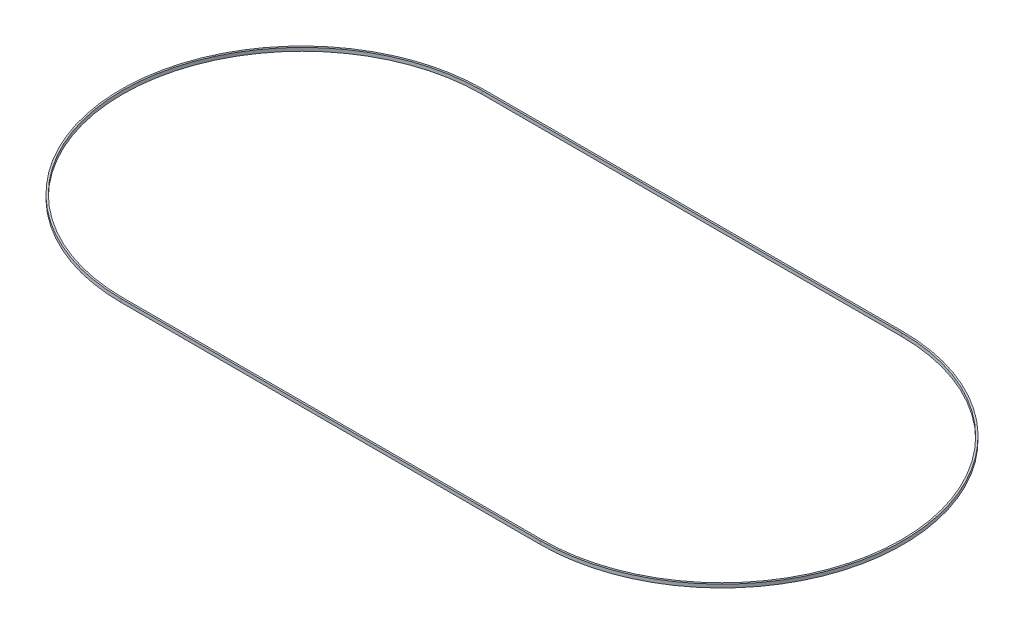
ISO-10303-21;
HEADER;
FILE_DESCRIPTION(('STEP AP214'),'2;1');
FILE_NAME('part.step','',(''),(''),'','','');
FILE_SCHEMA(('AUTOMOTIVE_DESIGN { 1 0 10303 214 1 1 1 1 }'));
ENDSEC;
DATA;
#1=APPLICATION_CONTEXT('core data for automotive mechanical design processes');
#2=APPLICATION_PROTOCOL_DEFINITION('international standard','automotive_design',2000,#1);
#3=PRODUCT_CONTEXT('',#1,'mechanical');
#4=PRODUCT('Part','Part','',(#3));
#5=PRODUCT_RELATED_PRODUCT_CATEGORY('part','',(#4));
#6=PRODUCT_DEFINITION_FORMATION('','',#4);
#7=PRODUCT_DEFINITION_CONTEXT('part definition',#1,'design');
#8=PRODUCT_DEFINITION('design','',#6,#7);
#9=PRODUCT_DEFINITION_SHAPE('','',#8);
#10=(LENGTH_UNIT() NAMED_UNIT(*) SI_UNIT(.MILLI.,.METRE.));
#11=(NAMED_UNIT(*) PLANE_ANGLE_UNIT() SI_UNIT($,.RADIAN.));
#12=(NAMED_UNIT(*) SI_UNIT($,.STERADIAN.) SOLID_ANGLE_UNIT());
#13=UNCERTAINTY_MEASURE_WITH_UNIT(LENGTH_MEASURE(1.E-05),#10,'distance_accuracy_value','');
#14=(GEOMETRIC_REPRESENTATION_CONTEXT(3) GLOBAL_UNCERTAINTY_ASSIGNED_CONTEXT((#13)) GLOBAL_UNIT_ASSIGNED_CONTEXT((#10,
#11,#12)) REPRESENTATION_CONTEXT('',''));
#15=CARTESIAN_POINT('',(0.,0.,0.));
#16=DIRECTION('',(0.,0.,1.));
#17=DIRECTION('',(1.,0.,0.));
#18=AXIS2_PLACEMENT_3D('',#15,#16,#17);
#19=CARTESIAN_POINT('',(-25000.,400.,-21600.));
#20=DIRECTION('',(0.,0.,-1.));
#21=DIRECTION('',(-1.,0.,0.));
#22=AXIS2_PLACEMENT_3D('',#19,#20,#21);
#23=PLANE('',#22);
#24=DIRECTION('',(1.,0.,0.));
#25=VECTOR('',#24,1.);
#26=CARTESIAN_POINT('',(-25000.,0.,-21600.));
#27=LINE('',#26,#25);
#28=CARTESIAN_POINT('',(-25000.,0.,-21600.));
#29=VERTEX_POINT('',#28);
#30=CARTESIAN_POINT('',(25000.,0.,-21600.));
#31=VERTEX_POINT('',#30);
#32=EDGE_CURVE('E152',#29,#31,#27,.T.);
#33=ORIENTED_EDGE('',*,*,#32,.F.);
#34=DIRECTION('',(0.,-1.,0.));
#35=VECTOR('',#34,1.);
#36=CARTESIAN_POINT('',(-25000.,400.,-21600.));
#37=LINE('',#36,#35);
#38=CARTESIAN_POINT('',(-25000.,400.,-21600.));
#39=VERTEX_POINT('',#38);
#40=EDGE_CURVE('E12',#39,#29,#37,.T.);
#41=ORIENTED_EDGE('',*,*,#40,.F.);
#42=DIRECTION('',(1.,0.,0.));
#43=VECTOR('',#42,1.);
#44=CARTESIAN_POINT('',(-25000.,400.,-21600.));
#45=LINE('',#44,#43);
#46=CARTESIAN_POINT('',(25000.,400.,-21600.));
#47=VERTEX_POINT('',#46);
#48=EDGE_CURVE('E156',#39,#47,#45,.T.);
#49=ORIENTED_EDGE('',*,*,#48,.T.);
#50=DIRECTION('',(0.,-1.,0.));
#51=VECTOR('',#50,1.);
#52=CARTESIAN_POINT('',(25000.,400.,-21600.));
#53=LINE('',#52,#51);
#54=EDGE_CURVE('E59',#47,#31,#53,.T.);
#55=ORIENTED_EDGE('',*,*,#54,.T.);
#56=EDGE_LOOP('',(#33,#41,#49,#55));
#57=FACE_BOUND('',#56,.T.);
#58=ADVANCED_FACE('F56',(#57),#23,.T.);
#59=CARTESIAN_POINT('',(-25000.,400.,9.18485099360515E-12));
#60=DIRECTION('',(0.,-1.,0.));
#61=DIRECTION('',(0.,0.,-1.));
#62=AXIS2_PLACEMENT_3D('',#59,#60,#61);
#63=CYLINDRICAL_SURFACE('',#62,21600.);
#64=CARTESIAN_POINT('',(-25000.,0.,9.18485099360515E-12));
#65=DIRECTION('',(0.,1.,0.));
#66=DIRECTION('',(0.,0.,1.));
#67=AXIS2_PLACEMENT_3D('',#64,#65,#66);
#68=CIRCLE('',#67,21600.);
#69=CARTESIAN_POINT('',(-25000.,0.,21600.));
#70=VERTEX_POINT('',#69);
#71=EDGE_CURVE('E160',#29,#70,#68,.T.);
#72=ORIENTED_EDGE('',*,*,#71,.T.);
#73=DIRECTION('',(0.,-1.,0.));
#74=VECTOR('',#73,1.);
#75=CARTESIAN_POINT('',(-25000.,400.,21600.));
#76=LINE('',#75,#74);
#77=CARTESIAN_POINT('',(-25000.,400.,21600.));
#78=VERTEX_POINT('',#77);
#79=EDGE_CURVE('E64',#78,#70,#76,.T.);
#80=ORIENTED_EDGE('',*,*,#79,.F.);
#81=CARTESIAN_POINT('',(-25000.,400.,9.18485099360515E-12));
#82=DIRECTION('',(0.,1.,0.));
#83=DIRECTION('',(0.,0.,1.));
#84=AXIS2_PLACEMENT_3D('',#81,#82,#83);
#85=CIRCLE('',#84,21600.);
#86=EDGE_CURVE('E165',#39,#78,#85,.T.);
#87=ORIENTED_EDGE('',*,*,#86,.F.);
#88=ORIENTED_EDGE('',*,*,#40,.T.);
#89=EDGE_LOOP('',(#72,#80,#87,#88));
#90=FACE_BOUND('',#89,.T.);
#91=ADVANCED_FACE('F192',(#90),#63,.T.);
#92=CARTESIAN_POINT('',(-25000.,400.,21600.));
#93=DIRECTION('',(0.,0.,-1.));
#94=DIRECTION('',(-1.,0.,0.));
#95=AXIS2_PLACEMENT_3D('',#92,#93,#94);
#96=PLANE('',#95);
#97=DIRECTION('',(1.,0.,0.));
#98=VECTOR('',#97,1.);
#99=CARTESIAN_POINT('',(-25000.,0.,21600.));
#100=LINE('',#99,#98);
#101=CARTESIAN_POINT('',(25000.,0.,21600.));
#102=VERTEX_POINT('',#101);
#103=EDGE_CURVE('E172',#70,#102,#100,.T.);
#104=ORIENTED_EDGE('',*,*,#103,.T.);
#105=DIRECTION('',(0.,-1.,0.));
#106=VECTOR('',#105,1.);
#107=CARTESIAN_POINT('',(25000.,400.,21600.));
#108=LINE('',#107,#106);
#109=CARTESIAN_POINT('',(25000.,400.,21600.));
#110=VERTEX_POINT('',#109);
#111=EDGE_CURVE('E177',#110,#102,#108,.T.);
#112=ORIENTED_EDGE('',*,*,#111,.F.);
#113=DIRECTION('',(1.,0.,0.));
#114=VECTOR('',#113,1.);
#115=CARTESIAN_POINT('',(-25000.,400.,21600.));
#116=LINE('',#115,#114);
#117=EDGE_CURVE('E163',#78,#110,#116,.T.);
#118=ORIENTED_EDGE('',*,*,#117,.F.);
#119=ORIENTED_EDGE('',*,*,#79,.T.);
#120=EDGE_LOOP('',(#104,#112,#118,#119));
#121=FACE_BOUND('',#120,.T.);
#122=ADVANCED_FACE('F196',(#121),#96,.F.);
#123=CARTESIAN_POINT('',(25000.,400.,0.));
#124=DIRECTION('',(0.,-1.,0.));
#125=DIRECTION('',(0.,0.,-1.));
#126=AXIS2_PLACEMENT_3D('',#123,#124,#125);
#127=CYLINDRICAL_SURFACE('',#126,21600.);
#128=CARTESIAN_POINT('',(25000.,0.,0.));
#129=DIRECTION('',(0.,-1.,0.));
#130=DIRECTION('',(0.,0.,-1.));
#131=AXIS2_PLACEMENT_3D('',#128,#129,#130);
#132=CIRCLE('',#131,21600.);
#133=EDGE_CURVE('E169',#31,#102,#132,.T.);
#134=ORIENTED_EDGE('',*,*,#133,.F.);
#135=ORIENTED_EDGE('',*,*,#54,.F.);
#136=CARTESIAN_POINT('',(25000.,400.,0.));
#137=DIRECTION('',(0.,-1.,0.));
#138=DIRECTION('',(0.,0.,-1.));
#139=AXIS2_PLACEMENT_3D('',#136,#137,#138);
#140=CIRCLE('',#139,21600.);
#141=EDGE_CURVE('E159',#47,#110,#140,.T.);
#142=ORIENTED_EDGE('',*,*,#141,.T.);
#143=ORIENTED_EDGE('',*,*,#111,.T.);
#144=EDGE_LOOP('',(#134,#135,#142,#143));
#145=FACE_BOUND('',#144,.T.);
#146=ADVANCED_FACE('F185',(#145),#127,.T.);
#147=CARTESIAN_POINT('',(25000.,400.,0.));
#148=DIRECTION('',(0.,-1.,0.));
#149=DIRECTION('',(0.,0.,-1.));
#150=AXIS2_PLACEMENT_3D('',#147,#148,#149);
#151=PLANE('',#150);
#152=CARTESIAN_POINT('',(-25000.,400.,9.84811851154435E-12));
#153=DIRECTION('',(0.,1.,0.));
#154=DIRECTION('',(0.,0.,1.));
#155=AXIS2_PLACEMENT_3D('',#152,#153,#154);
#156=CIRCLE('',#155,21400.);
#157=CARTESIAN_POINT('',(-25000.,400.,-21400.));
#158=VERTEX_POINT('',#157);
#159=CARTESIAN_POINT('',(-25000.,400.,21400.));
#160=VERTEX_POINT('',#159);
#161=EDGE_CURVE('E126',#158,#160,#156,.T.);
#162=ORIENTED_EDGE('',*,*,#161,.F.);
#163=DIRECTION('',(1.,0.,0.));
#164=VECTOR('',#163,1.);
#165=CARTESIAN_POINT('',(-25000.,400.,-21400.));
#166=LINE('',#165,#164);
#167=CARTESIAN_POINT('',(25000.,400.,-21400.));
#168=VERTEX_POINT('',#167);
#169=EDGE_CURVE('E123',#158,#168,#166,.T.);
#170=ORIENTED_EDGE('',*,*,#169,.T.);
#171=CARTESIAN_POINT('',(25000.,400.,6.63267517939197E-13));
#172=DIRECTION('',(0.,-1.,0.));
#173=DIRECTION('',(0.,0.,-1.));
#174=AXIS2_PLACEMENT_3D('',#171,#172,#173);
#175=CIRCLE('',#174,21400.);
#176=CARTESIAN_POINT('',(25000.,400.,21400.));
#177=VERTEX_POINT('',#176);
#178=EDGE_CURVE('E129',#168,#177,#175,.T.);
#179=ORIENTED_EDGE('',*,*,#178,.T.);
#180=DIRECTION('',(1.,0.,0.));
#181=VECTOR('',#180,1.);
#182=CARTESIAN_POINT('',(-25000.,400.,21400.));
#183=LINE('',#182,#181);
#184=EDGE_CURVE('E133',#160,#177,#183,.T.);
#185=ORIENTED_EDGE('',*,*,#184,.F.);
#186=EDGE_LOOP('',(#162,#170,#179,#185));
#187=FACE_BOUND('',#186,.T.);
#188=ORIENTED_EDGE('',*,*,#48,.F.);
#189=ORIENTED_EDGE('',*,*,#86,.T.);
#190=ORIENTED_EDGE('',*,*,#117,.T.);
#191=ORIENTED_EDGE('',*,*,#141,.F.);
#192=EDGE_LOOP('',(#188,#189,#190,#191));
#193=FACE_BOUND('',#192,.T.);
#194=ADVANCED_FACE('F135',(#187,#193),#151,.F.);
#195=CARTESIAN_POINT('',(25000.,0.,0.));
#196=DIRECTION('',(0.,-1.,0.));
#197=DIRECTION('',(0.,0.,-1.));
#198=AXIS2_PLACEMENT_3D('',#195,#196,#197);
#199=PLANE('',#198);
#200=DIRECTION('',(1.,0.,0.));
#201=VECTOR('',#200,1.);
#202=CARTESIAN_POINT('',(-25000.,0.,-21400.));
#203=LINE('',#202,#201);
#204=CARTESIAN_POINT('',(-25000.,0.,-21400.));
#205=VERTEX_POINT('',#204);
#206=CARTESIAN_POINT('',(25000.,0.,-21400.));
#207=VERTEX_POINT('',#206);
#208=EDGE_CURVE('E80',#205,#207,#203,.T.);
#209=ORIENTED_EDGE('',*,*,#208,.F.);
#210=CARTESIAN_POINT('',(-25000.,0.,9.84811851154435E-12));
#211=DIRECTION('',(0.,1.,0.));
#212=DIRECTION('',(0.,0.,1.));
#213=AXIS2_PLACEMENT_3D('',#210,#211,#212);
#214=CIRCLE('',#213,21400.);
#215=CARTESIAN_POINT('',(-25000.,0.,21400.));
#216=VERTEX_POINT('',#215);
#217=EDGE_CURVE('E137',#205,#216,#214,.T.);
#218=ORIENTED_EDGE('',*,*,#217,.T.);
#219=DIRECTION('',(1.,0.,0.));
#220=VECTOR('',#219,1.);
#221=CARTESIAN_POINT('',(-25000.,0.,21400.));
#222=LINE('',#221,#220);
#223=CARTESIAN_POINT('',(25000.,0.,21400.));
#224=VERTEX_POINT('',#223);
#225=EDGE_CURVE('E140',#216,#224,#222,.T.);
#226=ORIENTED_EDGE('',*,*,#225,.T.);
#227=CARTESIAN_POINT('',(25000.,0.,6.63267517939197E-13));
#228=DIRECTION('',(0.,-1.,0.));
#229=DIRECTION('',(0.,0.,-1.));
#230=AXIS2_PLACEMENT_3D('',#227,#228,#229);
#231=CIRCLE('',#230,21400.);
#232=EDGE_CURVE('E146',#207,#224,#231,.T.);
#233=ORIENTED_EDGE('',*,*,#232,.F.);
#234=EDGE_LOOP('',(#209,#218,#226,#233));
#235=FACE_BOUND('',#234,.T.);
#236=ORIENTED_EDGE('',*,*,#32,.T.);
#237=ORIENTED_EDGE('',*,*,#133,.T.);
#238=ORIENTED_EDGE('',*,*,#103,.F.);
#239=ORIENTED_EDGE('',*,*,#71,.F.);
#240=EDGE_LOOP('',(#236,#237,#238,#239));
#241=FACE_BOUND('',#240,.T.);
#242=ADVANCED_FACE('F189',(#235,#241),#199,.T.);
#243=CARTESIAN_POINT('',(-25000.,400.,-21400.));
#244=DIRECTION('',(0.,0.,-1.));
#245=DIRECTION('',(-1.,0.,0.));
#246=AXIS2_PLACEMENT_3D('',#243,#244,#245);
#247=PLANE('',#246);
#248=ORIENTED_EDGE('',*,*,#208,.T.);
#249=DIRECTION('',(0.,-1.,0.));
#250=VECTOR('',#249,1.);
#251=CARTESIAN_POINT('',(25000.,400.,-21400.));
#252=LINE('',#251,#250);
#253=EDGE_CURVE('E120',#168,#207,#252,.T.);
#254=ORIENTED_EDGE('',*,*,#253,.F.);
#255=ORIENTED_EDGE('',*,*,#169,.F.);
#256=DIRECTION('',(0.,-1.,0.));
#257=VECTOR('',#256,1.);
#258=CARTESIAN_POINT('',(-25000.,400.,-21400.));
#259=LINE('',#258,#257);
#260=EDGE_CURVE('E150',#158,#205,#259,.T.);
#261=ORIENTED_EDGE('',*,*,#260,.T.);
#262=EDGE_LOOP('',(#248,#254,#255,#261));
#263=FACE_BOUND('',#262,.T.);
#264=ADVANCED_FACE('F121',(#263),#247,.F.);
#265=CARTESIAN_POINT('',(-25000.,400.,9.84811851154435E-12));
#266=DIRECTION('',(0.,-1.,0.));
#267=DIRECTION('',(0.,0.,-1.));
#268=AXIS2_PLACEMENT_3D('',#265,#266,#267);
#269=CYLINDRICAL_SURFACE('',#268,21400.);
#270=ORIENTED_EDGE('',*,*,#217,.F.);
#271=ORIENTED_EDGE('',*,*,#260,.F.);
#272=ORIENTED_EDGE('',*,*,#161,.T.);
#273=DIRECTION('',(0.,-1.,0.));
#274=VECTOR('',#273,1.);
#275=CARTESIAN_POINT('',(-25000.,400.,21400.));
#276=LINE('',#275,#274);
#277=EDGE_CURVE('E153',#160,#216,#276,.T.);
#278=ORIENTED_EDGE('',*,*,#277,.T.);
#279=EDGE_LOOP('',(#270,#271,#272,#278));
#280=FACE_BOUND('',#279,.T.);
#281=ADVANCED_FACE('F240',(#280),#269,.F.);
#282=CARTESIAN_POINT('',(-25000.,400.,21400.));
#283=DIRECTION('',(0.,0.,-1.));
#284=DIRECTION('',(-1.,0.,0.));
#285=AXIS2_PLACEMENT_3D('',#282,#283,#284);
#286=PLANE('',#285);
#287=ORIENTED_EDGE('',*,*,#225,.F.);
#288=ORIENTED_EDGE('',*,*,#277,.F.);
#289=ORIENTED_EDGE('',*,*,#184,.T.);
#290=DIRECTION('',(0.,-1.,0.));
#291=VECTOR('',#290,1.);
#292=CARTESIAN_POINT('',(25000.,400.,21400.));
#293=LINE('',#292,#291);
#294=EDGE_CURVE('E72',#177,#224,#293,.T.);
#295=ORIENTED_EDGE('',*,*,#294,.T.);
#296=EDGE_LOOP('',(#287,#288,#289,#295));
#297=FACE_BOUND('',#296,.T.);
#298=ADVANCED_FACE('F248',(#297),#286,.T.);
#299=CARTESIAN_POINT('',(25000.,400.,6.63267517939197E-13));
#300=DIRECTION('',(0.,-1.,0.));
#301=DIRECTION('',(0.,0.,-1.));
#302=AXIS2_PLACEMENT_3D('',#299,#300,#301);
#303=CYLINDRICAL_SURFACE('',#302,21400.);
#304=ORIENTED_EDGE('',*,*,#232,.T.);
#305=ORIENTED_EDGE('',*,*,#294,.F.);
#306=ORIENTED_EDGE('',*,*,#178,.F.);
#307=ORIENTED_EDGE('',*,*,#253,.T.);
#308=EDGE_LOOP('',(#304,#305,#306,#307));
#309=FACE_BOUND('',#308,.T.);
#310=ADVANCED_FACE('F130',(#309),#303,.F.);
#311=CLOSED_SHELL('',(#58,#91,#122,#146,#194,#242,#264,#281,#298,#310));
#312=MANIFOLD_SOLID_BREP('B2',#311);
#313=ADVANCED_BREP_SHAPE_REPRESENTATION('',(#18,#312),#14);
#314=SHAPE_DEFINITION_REPRESENTATION(#9,#313);
ENDSEC;
END-ISO-10303-21;
